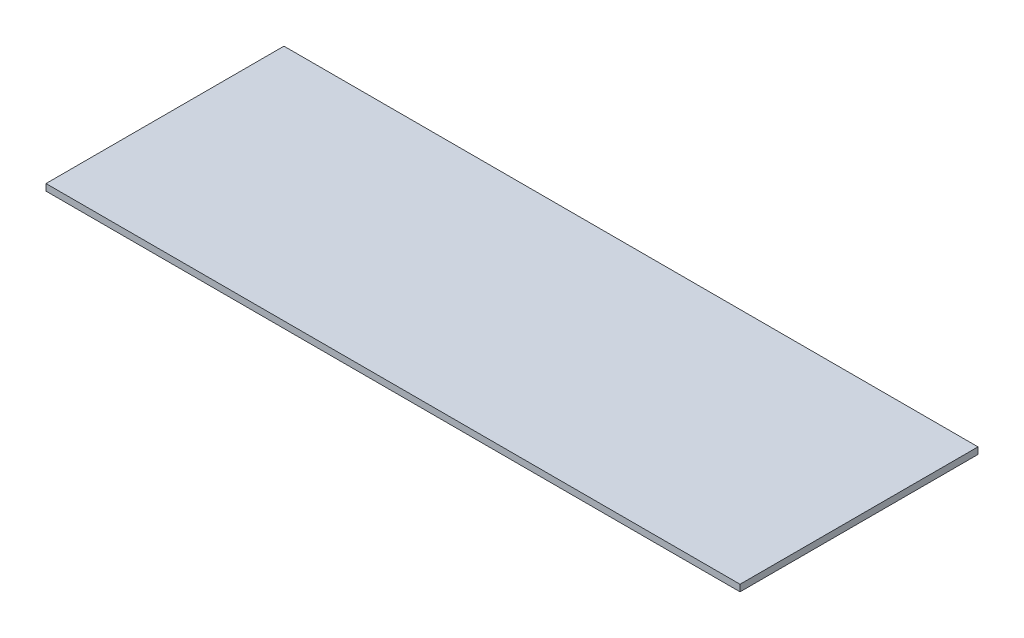
ISO-10303-21;
HEADER;
FILE_DESCRIPTION(('STEP AP214'),'2;1');
FILE_NAME('part.step','',(''),(''),'','','');
FILE_SCHEMA(('AUTOMOTIVE_DESIGN { 1 0 10303 214 1 1 1 1 }'));
ENDSEC;
DATA;
#1=APPLICATION_CONTEXT('core data for automotive mechanical design processes');
#2=APPLICATION_PROTOCOL_DEFINITION('international standard','automotive_design',2000,#1);
#3=PRODUCT_CONTEXT('',#1,'mechanical');
#4=PRODUCT('Part','Part','',(#3));
#5=PRODUCT_RELATED_PRODUCT_CATEGORY('part','',(#4));
#6=PRODUCT_DEFINITION_FORMATION('','',#4);
#7=PRODUCT_DEFINITION_CONTEXT('part definition',#1,'design');
#8=PRODUCT_DEFINITION('design','',#6,#7);
#9=PRODUCT_DEFINITION_SHAPE('','',#8);
#10=(LENGTH_UNIT() NAMED_UNIT(*) SI_UNIT(.MILLI.,.METRE.));
#11=(NAMED_UNIT(*) PLANE_ANGLE_UNIT() SI_UNIT($,.RADIAN.));
#12=(NAMED_UNIT(*) SI_UNIT($,.STERADIAN.) SOLID_ANGLE_UNIT());
#13=UNCERTAINTY_MEASURE_WITH_UNIT(LENGTH_MEASURE(1.E-05),#10,'distance_accuracy_value','');
#14=(GEOMETRIC_REPRESENTATION_CONTEXT(3) GLOBAL_UNCERTAINTY_ASSIGNED_CONTEXT((#13)) GLOBAL_UNIT_ASSIGNED_CONTEXT((#10,
#11,#12)) REPRESENTATION_CONTEXT('',''));
#15=CARTESIAN_POINT('',(0.,0.,0.));
#16=DIRECTION('',(0.,0.,1.));
#17=DIRECTION('',(1.,0.,0.));
#18=AXIS2_PLACEMENT_3D('',#15,#16,#17);
#19=CARTESIAN_POINT('',(105.,1.,36.));
#20=DIRECTION('',(-1.,0.,0.));
#21=DIRECTION('',(0.,0.,1.));
#22=AXIS2_PLACEMENT_3D('',#19,#20,#21);
#23=PLANE('',#22);
#24=DIRECTION('',(0.,0.,-1.));
#25=VECTOR('',#24,1.);
#26=CARTESIAN_POINT('',(105.,-1.,36.));
#27=LINE('',#26,#25);
#28=CARTESIAN_POINT('',(105.,-1.,36.));
#29=VERTEX_POINT('',#28);
#30=CARTESIAN_POINT('',(105.,-1.,-36.));
#31=VERTEX_POINT('',#30);
#32=EDGE_CURVE('E96',#29,#31,#27,.T.);
#33=ORIENTED_EDGE('',*,*,#32,.T.);
#34=DIRECTION('',(0.,-1.,0.));
#35=VECTOR('',#34,1.);
#36=CARTESIAN_POINT('',(105.,1.,-36.));
#37=LINE('',#36,#35);
#38=CARTESIAN_POINT('',(105.,1.,-36.));
#39=VERTEX_POINT('',#38);
#40=EDGE_CURVE('E11',#39,#31,#37,.T.);
#41=ORIENTED_EDGE('',*,*,#40,.F.);
#42=DIRECTION('',(0.,0.,-1.));
#43=VECTOR('',#42,1.);
#44=CARTESIAN_POINT('',(105.,1.,36.));
#45=LINE('',#44,#43);
#46=CARTESIAN_POINT('',(105.,1.,36.));
#47=VERTEX_POINT('',#46);
#48=EDGE_CURVE('E84',#47,#39,#45,.T.);
#49=ORIENTED_EDGE('',*,*,#48,.F.);
#50=DIRECTION('',(0.,-1.,0.));
#51=VECTOR('',#50,1.);
#52=CARTESIAN_POINT('',(105.,1.,36.));
#53=LINE('',#52,#51);
#54=EDGE_CURVE('E92',#47,#29,#53,.T.);
#55=ORIENTED_EDGE('',*,*,#54,.T.);
#56=EDGE_LOOP('',(#33,#41,#49,#55));
#57=FACE_BOUND('',#56,.T.);
#58=ADVANCED_FACE('F33',(#57),#23,.F.);
#59=CARTESIAN_POINT('',(-105.,1.,-36.));
#60=DIRECTION('',(0.,0.,1.));
#61=DIRECTION('',(1.,0.,0.));
#62=AXIS2_PLACEMENT_3D('',#59,#60,#61);
#63=PLANE('',#62);
#64=DIRECTION('',(-1.,0.,0.));
#65=VECTOR('',#64,1.);
#66=CARTESIAN_POINT('',(-105.,-1.,-36.));
#67=LINE('',#66,#65);
#68=CARTESIAN_POINT('',(-105.,-1.,-36.));
#69=VERTEX_POINT('',#68);
#70=EDGE_CURVE('E88',#31,#69,#67,.T.);
#71=ORIENTED_EDGE('',*,*,#70,.T.);
#72=DIRECTION('',(0.,-1.,0.));
#73=VECTOR('',#72,1.);
#74=CARTESIAN_POINT('',(-105.,1.,-36.));
#75=LINE('',#74,#73);
#76=CARTESIAN_POINT('',(-105.,1.,-36.));
#77=VERTEX_POINT('',#76);
#78=EDGE_CURVE('E41',#77,#69,#75,.T.);
#79=ORIENTED_EDGE('',*,*,#78,.F.);
#80=DIRECTION('',(-1.,0.,0.));
#81=VECTOR('',#80,1.);
#82=CARTESIAN_POINT('',(-105.,1.,-36.));
#83=LINE('',#82,#81);
#84=EDGE_CURVE('E79',#39,#77,#83,.T.);
#85=ORIENTED_EDGE('',*,*,#84,.F.);
#86=ORIENTED_EDGE('',*,*,#40,.T.);
#87=EDGE_LOOP('',(#71,#79,#85,#86));
#88=FACE_BOUND('',#87,.T.);
#89=ADVANCED_FACE('F87',(#88),#63,.F.);
#90=CARTESIAN_POINT('',(-105.,1.,36.));
#91=DIRECTION('',(1.,0.,0.));
#92=DIRECTION('',(0.,0.,-1.));
#93=AXIS2_PLACEMENT_3D('',#90,#91,#92);
#94=PLANE('',#93);
#95=DIRECTION('',(0.,0.,1.));
#96=VECTOR('',#95,1.);
#97=CARTESIAN_POINT('',(-105.,-1.,36.));
#98=LINE('',#97,#96);
#99=CARTESIAN_POINT('',(-105.,-1.,36.));
#100=VERTEX_POINT('',#99);
#101=EDGE_CURVE('E66',#69,#100,#98,.T.);
#102=ORIENTED_EDGE('',*,*,#101,.T.);
#103=DIRECTION('',(0.,-1.,0.));
#104=VECTOR('',#103,1.);
#105=CARTESIAN_POINT('',(-105.,1.,36.));
#106=LINE('',#105,#104);
#107=CARTESIAN_POINT('',(-105.,1.,36.));
#108=VERTEX_POINT('',#107);
#109=EDGE_CURVE('E89',#108,#100,#106,.T.);
#110=ORIENTED_EDGE('',*,*,#109,.F.);
#111=DIRECTION('',(0.,0.,1.));
#112=VECTOR('',#111,1.);
#113=CARTESIAN_POINT('',(-105.,1.,36.));
#114=LINE('',#113,#112);
#115=EDGE_CURVE('E82',#77,#108,#114,.T.);
#116=ORIENTED_EDGE('',*,*,#115,.F.);
#117=ORIENTED_EDGE('',*,*,#78,.T.);
#118=EDGE_LOOP('',(#102,#110,#116,#117));
#119=FACE_BOUND('',#118,.T.);
#120=ADVANCED_FACE('F90',(#119),#94,.F.);
#121=CARTESIAN_POINT('',(-105.,1.,36.));
#122=DIRECTION('',(0.,0.,-1.));
#123=DIRECTION('',(-1.,0.,0.));
#124=AXIS2_PLACEMENT_3D('',#121,#122,#123);
#125=PLANE('',#124);
#126=DIRECTION('',(1.,0.,0.));
#127=VECTOR('',#126,1.);
#128=CARTESIAN_POINT('',(-105.,-1.,36.));
#129=LINE('',#128,#127);
#130=EDGE_CURVE('E72',#100,#29,#129,.T.);
#131=ORIENTED_EDGE('',*,*,#130,.T.);
#132=ORIENTED_EDGE('',*,*,#54,.F.);
#133=DIRECTION('',(1.,0.,0.));
#134=VECTOR('',#133,1.);
#135=CARTESIAN_POINT('',(-105.,1.,36.));
#136=LINE('',#135,#134);
#137=EDGE_CURVE('E49',#108,#47,#136,.T.);
#138=ORIENTED_EDGE('',*,*,#137,.F.);
#139=ORIENTED_EDGE('',*,*,#109,.T.);
#140=EDGE_LOOP('',(#131,#132,#138,#139));
#141=FACE_BOUND('',#140,.T.);
#142=ADVANCED_FACE('F103',(#141),#125,.F.);
#143=CARTESIAN_POINT('',(0.,1.,0.));
#144=DIRECTION('',(0.,-1.,0.));
#145=DIRECTION('',(0.,0.,-1.));
#146=AXIS2_PLACEMENT_3D('',#143,#144,#145);
#147=PLANE('',#146);
#148=ORIENTED_EDGE('',*,*,#48,.T.);
#149=ORIENTED_EDGE('',*,*,#84,.T.);
#150=ORIENTED_EDGE('',*,*,#115,.T.);
#151=ORIENTED_EDGE('',*,*,#137,.T.);
#152=EDGE_LOOP('',(#148,#149,#150,#151));
#153=FACE_BOUND('',#152,.T.);
#154=ADVANCED_FACE('F80',(#153),#147,.F.);
#155=CARTESIAN_POINT('',(0.,-1.,0.));
#156=DIRECTION('',(0.,-1.,0.));
#157=DIRECTION('',(0.,0.,-1.));
#158=AXIS2_PLACEMENT_3D('',#155,#156,#157);
#159=PLANE('',#158);
#160=ORIENTED_EDGE('',*,*,#32,.F.);
#161=ORIENTED_EDGE('',*,*,#130,.F.);
#162=ORIENTED_EDGE('',*,*,#101,.F.);
#163=ORIENTED_EDGE('',*,*,#70,.F.);
#164=EDGE_LOOP('',(#160,#161,#162,#163));
#165=FACE_BOUND('',#164,.T.);
#166=ADVANCED_FACE('F106',(#165),#159,.T.);
#167=CLOSED_SHELL('',(#58,#89,#120,#142,#154,#166));
#168=MANIFOLD_SOLID_BREP('B2',#167);
#169=ADVANCED_BREP_SHAPE_REPRESENTATION('',(#18,#168),#14);
#170=SHAPE_DEFINITION_REPRESENTATION(#9,#169);
ENDSEC;
END-ISO-10303-21;
